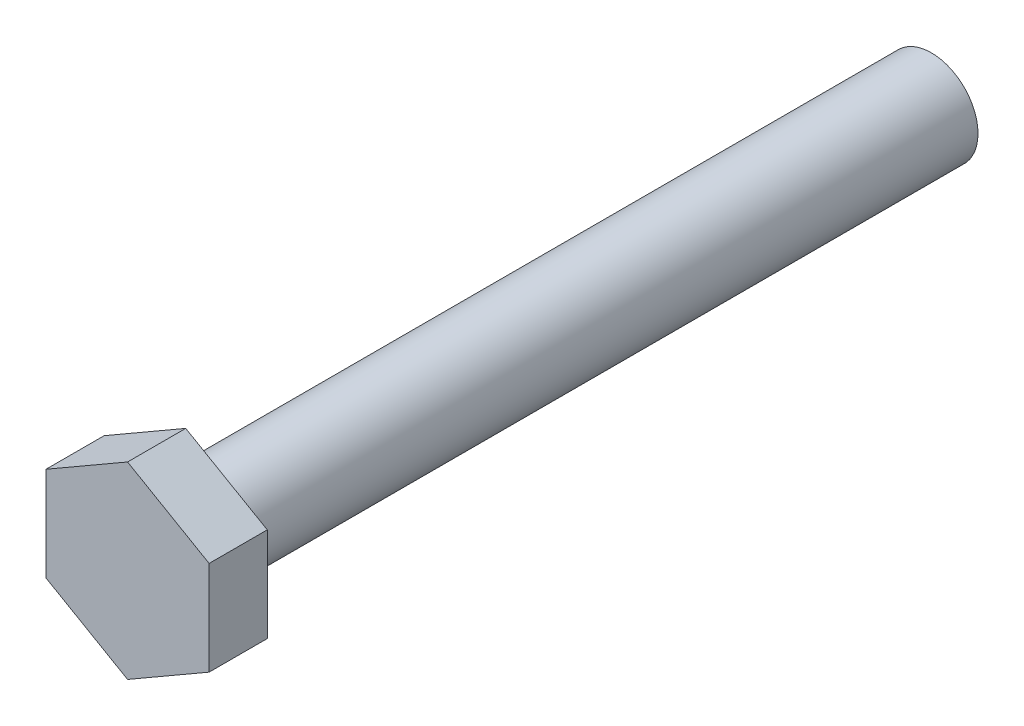
ISO-10303-21;
HEADER;
FILE_DESCRIPTION(('STEP AP214'),'2;1');
FILE_NAME('part.step','',(''),(''),'','','');
FILE_SCHEMA(('AUTOMOTIVE_DESIGN { 1 0 10303 214 1 1 1 1 }'));
ENDSEC;
DATA;
#1=APPLICATION_CONTEXT('core data for automotive mechanical design processes');
#2=APPLICATION_PROTOCOL_DEFINITION('international standard','automotive_design',2000,#1);
#3=PRODUCT_CONTEXT('',#1,'mechanical');
#4=PRODUCT('Part','Part','',(#3));
#5=PRODUCT_RELATED_PRODUCT_CATEGORY('part','',(#4));
#6=PRODUCT_DEFINITION_FORMATION('','',#4);
#7=PRODUCT_DEFINITION_CONTEXT('part definition',#1,'design');
#8=PRODUCT_DEFINITION('design','',#6,#7);
#9=PRODUCT_DEFINITION_SHAPE('','',#8);
#10=(LENGTH_UNIT() NAMED_UNIT(*) SI_UNIT(.MILLI.,.METRE.));
#11=(NAMED_UNIT(*) PLANE_ANGLE_UNIT() SI_UNIT($,.RADIAN.));
#12=(NAMED_UNIT(*) SI_UNIT($,.STERADIAN.) SOLID_ANGLE_UNIT());
#13=UNCERTAINTY_MEASURE_WITH_UNIT(LENGTH_MEASURE(1.E-05),#10,'distance_accuracy_value','');
#14=(GEOMETRIC_REPRESENTATION_CONTEXT(3) GLOBAL_UNCERTAINTY_ASSIGNED_CONTEXT((#13)) GLOBAL_UNIT_ASSIGNED_CONTEXT((#10,
#11,#12)) REPRESENTATION_CONTEXT('',''));
#15=CARTESIAN_POINT('',(0.,0.,0.));
#16=DIRECTION('',(0.,0.,1.));
#17=DIRECTION('',(1.,0.,0.));
#18=AXIS2_PLACEMENT_3D('',#15,#16,#17);
#19=CARTESIAN_POINT('',(0.,0.,50.8));
#20=DIRECTION('',(0.,0.,-1.));
#21=DIRECTION('',(-1.,0.,0.));
#22=AXIS2_PLACEMENT_3D('',#19,#20,#21);
#23=CYLINDRICAL_SURFACE('',#22,3.175);
#24=CARTESIAN_POINT('',(0.,0.,50.8));
#25=DIRECTION('',(0.,0.,1.));
#26=DIRECTION('',(1.,0.,0.));
#27=AXIS2_PLACEMENT_3D('',#24,#25,#26);
#28=CIRCLE('',#27,3.175);
#29=CARTESIAN_POINT('',(3.175,0.,50.8));
#30=VERTEX_POINT('',#29);
#31=EDGE_CURVE('E11',#30,#30,#28,.T.);
#32=ORIENTED_EDGE('',*,*,#31,.F.);
#33=EDGE_LOOP('',(#32));
#34=FACE_BOUND('',#33,.T.);
#35=CARTESIAN_POINT('',(0.,0.,0.));
#36=DIRECTION('',(0.,0.,1.));
#37=DIRECTION('',(1.,0.,0.));
#38=AXIS2_PLACEMENT_3D('',#35,#36,#37);
#39=CIRCLE('',#38,3.175);
#40=CARTESIAN_POINT('',(3.175,0.,0.));
#41=VERTEX_POINT('',#40);
#42=EDGE_CURVE('E48',#41,#41,#39,.T.);
#43=ORIENTED_EDGE('',*,*,#42,.T.);
#44=EDGE_LOOP('',(#43));
#45=FACE_BOUND('',#44,.T.);
#46=ADVANCED_FACE('F44',(#34,#45),#23,.T.);
#47=CARTESIAN_POINT('',(0.,0.,0.));
#48=DIRECTION('',(0.,0.,1.));
#49=DIRECTION('',(1.,0.,0.));
#50=AXIS2_PLACEMENT_3D('',#47,#48,#49);
#51=PLANE('',#50);
#52=ORIENTED_EDGE('',*,*,#42,.F.);
#53=EDGE_LOOP('',(#52));
#54=FACE_BOUND('',#53,.T.);
#55=ADVANCED_FACE('F168',(#54),#51,.F.);
#56=CARTESIAN_POINT('',(5.55625,-3.20790243318486,54.7624));
#57=DIRECTION('',(-1.,0.,0.));
#58=DIRECTION('',(0.,-1.,0.));
#59=AXIS2_PLACEMENT_3D('',#56,#57,#58);
#60=PLANE('',#59);
#61=DIRECTION('',(0.,1.,0.));
#62=VECTOR('',#61,1.);
#63=CARTESIAN_POINT('',(5.55625,-3.20790243318486,50.8));
#64=LINE('',#63,#62);
#65=CARTESIAN_POINT('',(5.55625,-3.20790243318486,50.8));
#66=VERTEX_POINT('',#65);
#67=CARTESIAN_POINT('',(5.55625,3.20790243318486,50.8));
#68=VERTEX_POINT('',#67);
#69=EDGE_CURVE('E132',#66,#68,#64,.T.);
#70=ORIENTED_EDGE('',*,*,#69,.T.);
#71=DIRECTION('',(0.,0.,-1.));
#72=VECTOR('',#71,1.);
#73=CARTESIAN_POINT('',(5.55625,3.20790243318486,54.7624));
#74=LINE('',#73,#72);
#75=CARTESIAN_POINT('',(5.55625,3.20790243318486,54.7624));
#76=VERTEX_POINT('',#75);
#77=EDGE_CURVE('E165',#76,#68,#74,.T.);
#78=ORIENTED_EDGE('',*,*,#77,.F.);
#79=DIRECTION('',(0.,1.,0.));
#80=VECTOR('',#79,1.);
#81=CARTESIAN_POINT('',(5.55625,-3.20790243318486,54.7624));
#82=LINE('',#81,#80);
#83=CARTESIAN_POINT('',(5.55625,-3.20790243318486,54.7624));
#84=VERTEX_POINT('',#83);
#85=EDGE_CURVE('E151',#84,#76,#82,.T.);
#86=ORIENTED_EDGE('',*,*,#85,.F.);
#87=DIRECTION('',(0.,0.,-1.));
#88=VECTOR('',#87,1.);
#89=CARTESIAN_POINT('',(5.55625,-3.20790243318486,54.7624));
#90=LINE('',#89,#88);
#91=EDGE_CURVE('E133',#84,#66,#90,.T.);
#92=ORIENTED_EDGE('',*,*,#91,.T.);
#93=EDGE_LOOP('',(#70,#78,#86,#92));
#94=FACE_BOUND('',#93,.T.);
#95=ADVANCED_FACE('F175',(#94),#60,.F.);
#96=CARTESIAN_POINT('',(5.55625,3.20790243318486,54.7624));
#97=DIRECTION('',(-0.5,-0.866025403784439,0.));
#98=DIRECTION('',(0.866025403784439,-0.5,0.));
#99=AXIS2_PLACEMENT_3D('',#96,#97,#98);
#100=PLANE('',#99);
#101=DIRECTION('',(-0.866025403784439,0.5,0.));
#102=VECTOR('',#101,1.);
#103=CARTESIAN_POINT('',(5.55625,3.20790243318486,50.8));
#104=LINE('',#103,#102);
#105=CARTESIAN_POINT('',(0.,6.41580486636971,50.8));
#106=VERTEX_POINT('',#105);
#107=EDGE_CURVE('E137',#68,#106,#104,.T.);
#108=ORIENTED_EDGE('',*,*,#107,.T.);
#109=DIRECTION('',(0.,0.,-1.));
#110=VECTOR('',#109,1.);
#111=CARTESIAN_POINT('',(0.,6.41580486636971,54.7624));
#112=LINE('',#111,#110);
#113=CARTESIAN_POINT('',(0.,6.41580486636971,54.7624));
#114=VERTEX_POINT('',#113);
#115=EDGE_CURVE('E158',#114,#106,#112,.T.);
#116=ORIENTED_EDGE('',*,*,#115,.F.);
#117=DIRECTION('',(-0.866025403784439,0.5,0.));
#118=VECTOR('',#117,1.);
#119=CARTESIAN_POINT('',(5.55625,3.20790243318486,54.7624));
#120=LINE('',#119,#118);
#121=EDGE_CURVE('E99',#76,#114,#120,.T.);
#122=ORIENTED_EDGE('',*,*,#121,.F.);
#123=ORIENTED_EDGE('',*,*,#77,.T.);
#124=EDGE_LOOP('',(#108,#116,#122,#123));
#125=FACE_BOUND('',#124,.T.);
#126=ADVANCED_FACE('F180',(#125),#100,.F.);
#127=CARTESIAN_POINT('',(0.,6.41580486636971,54.7624));
#128=DIRECTION('',(0.5,-0.866025403784439,0.));
#129=DIRECTION('',(0.866025403784439,0.5,0.));
#130=AXIS2_PLACEMENT_3D('',#127,#128,#129);
#131=PLANE('',#130);
#132=DIRECTION('',(-0.866025403784439,-0.5,0.));
#133=VECTOR('',#132,1.);
#134=CARTESIAN_POINT('',(0.,6.41580486636971,50.8));
#135=LINE('',#134,#133);
#136=CARTESIAN_POINT('',(-5.55625,3.20790243318486,50.8));
#137=VERTEX_POINT('',#136);
#138=EDGE_CURVE('E142',#106,#137,#135,.T.);
#139=ORIENTED_EDGE('',*,*,#138,.T.);
#140=DIRECTION('',(0.,0.,-1.));
#141=VECTOR('',#140,1.);
#142=CARTESIAN_POINT('',(-5.55625,3.20790243318486,54.7624));
#143=LINE('',#142,#141);
#144=CARTESIAN_POINT('',(-5.55625,3.20790243318486,54.7624));
#145=VERTEX_POINT('',#144);
#146=EDGE_CURVE('E122',#145,#137,#143,.T.);
#147=ORIENTED_EDGE('',*,*,#146,.F.);
#148=DIRECTION('',(-0.866025403784439,-0.5,0.));
#149=VECTOR('',#148,1.);
#150=CARTESIAN_POINT('',(0.,6.41580486636971,54.7624));
#151=LINE('',#150,#149);
#152=EDGE_CURVE('E114',#114,#145,#151,.T.);
#153=ORIENTED_EDGE('',*,*,#152,.F.);
#154=ORIENTED_EDGE('',*,*,#115,.T.);
#155=EDGE_LOOP('',(#139,#147,#153,#154));
#156=FACE_BOUND('',#155,.T.);
#157=ADVANCED_FACE('F184',(#156),#131,.F.);
#158=CARTESIAN_POINT('',(-5.55625,3.20790243318486,54.7624));
#159=DIRECTION('',(1.,0.,0.));
#160=DIRECTION('',(0.,0.,-1.));
#161=AXIS2_PLACEMENT_3D('',#158,#159,#160);
#162=PLANE('',#161);
#163=DIRECTION('',(0.,-1.,0.));
#164=VECTOR('',#163,1.);
#165=CARTESIAN_POINT('',(-5.55625,3.20790243318486,50.8));
#166=LINE('',#165,#164);
#167=CARTESIAN_POINT('',(-5.55625,-3.20790243318486,50.8));
#168=VERTEX_POINT('',#167);
#169=EDGE_CURVE('E125',#137,#168,#166,.T.);
#170=ORIENTED_EDGE('',*,*,#169,.T.);
#171=DIRECTION('',(0.,0.,-1.));
#172=VECTOR('',#171,1.);
#173=CARTESIAN_POINT('',(-5.55625,-3.20790243318486,54.7624));
#174=LINE('',#173,#172);
#175=CARTESIAN_POINT('',(-5.55625,-3.20790243318486,54.7624));
#176=VERTEX_POINT('',#175);
#177=EDGE_CURVE('E119',#176,#168,#174,.T.);
#178=ORIENTED_EDGE('',*,*,#177,.F.);
#179=DIRECTION('',(0.,-1.,0.));
#180=VECTOR('',#179,1.);
#181=CARTESIAN_POINT('',(-5.55625,3.20790243318486,54.7624));
#182=LINE('',#181,#180);
#183=EDGE_CURVE('E110',#145,#176,#182,.T.);
#184=ORIENTED_EDGE('',*,*,#183,.F.);
#185=ORIENTED_EDGE('',*,*,#146,.T.);
#186=EDGE_LOOP('',(#170,#178,#184,#185));
#187=FACE_BOUND('',#186,.T.);
#188=ADVANCED_FACE('F117',(#187),#162,.F.);
#189=CARTESIAN_POINT('',(-5.55625,-3.20790243318486,54.7624));
#190=DIRECTION('',(0.5,0.866025403784439,0.));
#191=DIRECTION('',(-0.866025403784439,0.5,0.));
#192=AXIS2_PLACEMENT_3D('',#189,#190,#191);
#193=PLANE('',#192);
#194=DIRECTION('',(0.866025403784439,-0.5,0.));
#195=VECTOR('',#194,1.);
#196=CARTESIAN_POINT('',(-5.55625,-3.20790243318486,50.8));
#197=LINE('',#196,#195);
#198=CARTESIAN_POINT('',(0.,-6.41580486636972,50.8));
#199=VERTEX_POINT('',#198);
#200=EDGE_CURVE('E84',#168,#199,#197,.T.);
#201=ORIENTED_EDGE('',*,*,#200,.T.);
#202=DIRECTION('',(0.,0.,-1.));
#203=VECTOR('',#202,1.);
#204=CARTESIAN_POINT('',(0.,-6.41580486636972,54.7624));
#205=LINE('',#204,#203);
#206=CARTESIAN_POINT('',(0.,-6.41580486636972,54.7624));
#207=VERTEX_POINT('',#206);
#208=EDGE_CURVE('E124',#207,#199,#205,.T.);
#209=ORIENTED_EDGE('',*,*,#208,.F.);
#210=DIRECTION('',(0.866025403784439,-0.5,0.));
#211=VECTOR('',#210,1.);
#212=CARTESIAN_POINT('',(-5.55625,-3.20790243318486,54.7624));
#213=LINE('',#212,#211);
#214=EDGE_CURVE('E112',#176,#207,#213,.T.);
#215=ORIENTED_EDGE('',*,*,#214,.F.);
#216=ORIENTED_EDGE('',*,*,#177,.T.);
#217=EDGE_LOOP('',(#201,#209,#215,#216));
#218=FACE_BOUND('',#217,.T.);
#219=ADVANCED_FACE('F130',(#218),#193,.F.);
#220=CARTESIAN_POINT('',(0.,-6.41580486636972,54.7624));
#221=DIRECTION('',(-0.5,0.866025403784438,0.));
#222=DIRECTION('',(-0.866025403784439,-0.5,0.));
#223=AXIS2_PLACEMENT_3D('',#220,#221,#222);
#224=PLANE('',#223);
#225=DIRECTION('',(0.866025403784439,0.5,0.));
#226=VECTOR('',#225,1.);
#227=CARTESIAN_POINT('',(0.,-6.41580486636972,50.8));
#228=LINE('',#227,#226);
#229=EDGE_CURVE('E93',#199,#66,#228,.T.);
#230=ORIENTED_EDGE('',*,*,#229,.T.);
#231=ORIENTED_EDGE('',*,*,#91,.F.);
#232=DIRECTION('',(0.866025403784439,0.5,0.));
#233=VECTOR('',#232,1.);
#234=CARTESIAN_POINT('',(0.,-6.41580486636972,54.7624));
#235=LINE('',#234,#233);
#236=EDGE_CURVE('E65',#207,#84,#235,.T.);
#237=ORIENTED_EDGE('',*,*,#236,.F.);
#238=ORIENTED_EDGE('',*,*,#208,.T.);
#239=EDGE_LOOP('',(#230,#231,#237,#238));
#240=FACE_BOUND('',#239,.T.);
#241=ADVANCED_FACE('F195',(#240),#224,.F.);
#242=CARTESIAN_POINT('',(0.,0.,54.7624));
#243=DIRECTION('',(0.,0.,1.));
#244=DIRECTION('',(1.,0.,0.));
#245=AXIS2_PLACEMENT_3D('',#242,#243,#244);
#246=PLANE('',#245);
#247=ORIENTED_EDGE('',*,*,#85,.T.);
#248=ORIENTED_EDGE('',*,*,#121,.T.);
#249=ORIENTED_EDGE('',*,*,#152,.T.);
#250=ORIENTED_EDGE('',*,*,#183,.T.);
#251=ORIENTED_EDGE('',*,*,#214,.T.);
#252=ORIENTED_EDGE('',*,*,#236,.T.);
#253=EDGE_LOOP('',(#247,#248,#249,#250,#251,#252));
#254=FACE_BOUND('',#253,.T.);
#255=ADVANCED_FACE('F108',(#254),#246,.T.);
#256=CARTESIAN_POINT('',(0.,0.,50.8));
#257=DIRECTION('',(0.,0.,1.));
#258=DIRECTION('',(1.,0.,0.));
#259=AXIS2_PLACEMENT_3D('',#256,#257,#258);
#260=PLANE('',#259);
#261=ORIENTED_EDGE('',*,*,#31,.T.);
#262=EDGE_LOOP('',(#261));
#263=FACE_BOUND('',#262,.T.);
#264=ORIENTED_EDGE('',*,*,#69,.F.);
#265=ORIENTED_EDGE('',*,*,#229,.F.);
#266=ORIENTED_EDGE('',*,*,#200,.F.);
#267=ORIENTED_EDGE('',*,*,#169,.F.);
#268=ORIENTED_EDGE('',*,*,#138,.F.);
#269=ORIENTED_EDGE('',*,*,#107,.F.);
#270=EDGE_LOOP('',(#264,#265,#266,#267,#268,#269));
#271=FACE_BOUND('',#270,.T.);
#272=ADVANCED_FACE('F194',(#263,#271),#260,.F.);
#273=CLOSED_SHELL('',(#46,#55,#95,#126,#157,#188,#219,#241,#255,#272));
#274=MANIFOLD_SOLID_BREP('B2',#273);
#275=ADVANCED_BREP_SHAPE_REPRESENTATION('',(#18,#274),#14);
#276=SHAPE_DEFINITION_REPRESENTATION(#9,#275);
ENDSEC;
END-ISO-10303-21;
